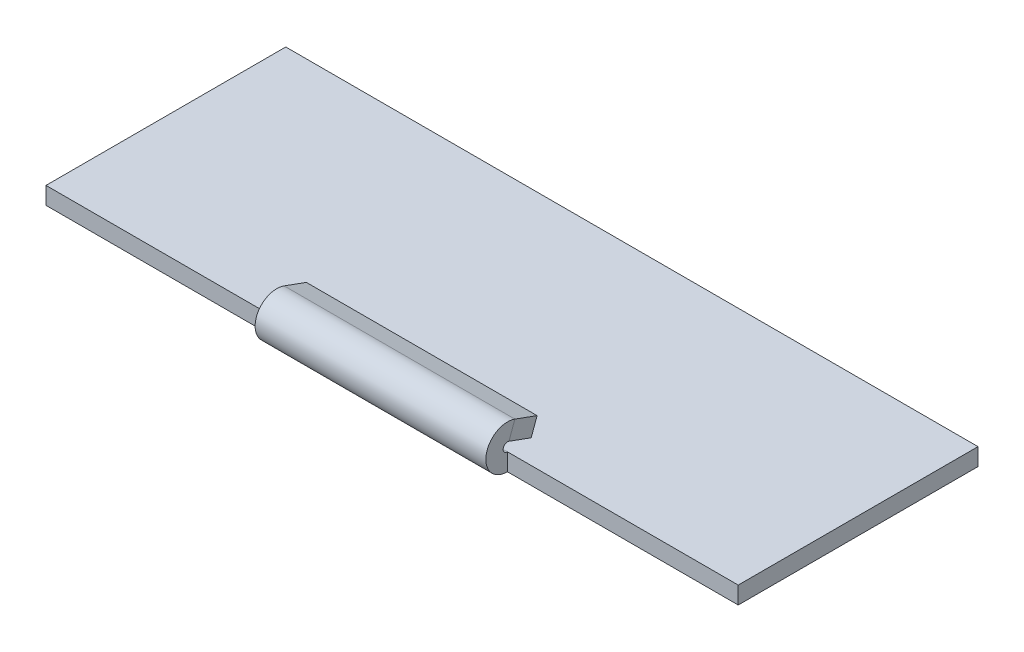
ISO-10303-21;
HEADER;
FILE_DESCRIPTION(('STEP AP214'),'2;1');
FILE_NAME('part.step','',(''),(''),'','','');
FILE_SCHEMA(('AUTOMOTIVE_DESIGN { 1 0 10303 214 1 1 1 1 }'));
ENDSEC;
DATA;
#1=APPLICATION_CONTEXT('core data for automotive mechanical design processes');
#2=APPLICATION_PROTOCOL_DEFINITION('international standard','automotive_design',2000,#1);
#3=PRODUCT_CONTEXT('',#1,'mechanical');
#4=PRODUCT('Part','Part','',(#3));
#5=PRODUCT_RELATED_PRODUCT_CATEGORY('part','',(#4));
#6=PRODUCT_DEFINITION_FORMATION('','',#4);
#7=PRODUCT_DEFINITION_CONTEXT('part definition',#1,'design');
#8=PRODUCT_DEFINITION('design','',#6,#7);
#9=PRODUCT_DEFINITION_SHAPE('','',#8);
#10=(LENGTH_UNIT() NAMED_UNIT(*) SI_UNIT(.MILLI.,.METRE.));
#11=(NAMED_UNIT(*) PLANE_ANGLE_UNIT() SI_UNIT($,.RADIAN.));
#12=(NAMED_UNIT(*) SI_UNIT($,.STERADIAN.) SOLID_ANGLE_UNIT());
#13=UNCERTAINTY_MEASURE_WITH_UNIT(LENGTH_MEASURE(1.E-05),#10,'distance_accuracy_value','');
#14=(GEOMETRIC_REPRESENTATION_CONTEXT(3) GLOBAL_UNCERTAINTY_ASSIGNED_CONTEXT((#13)) GLOBAL_UNIT_ASSIGNED_CONTEXT((#10,
#11,#12)) REPRESENTATION_CONTEXT('',''));
#15=CARTESIAN_POINT('',(0.,0.,0.));
#16=DIRECTION('',(0.,0.,1.));
#17=DIRECTION('',(1.,0.,0.));
#18=AXIS2_PLACEMENT_3D('',#15,#16,#17);
#19=CARTESIAN_POINT('',(0.,3.64863291385937,17.4952710197256));
#20=DIRECTION('',(0.,0.342020143325676,0.939692620785906));
#21=DIRECTION('',(1.,0.,0.));
#22=AXIS2_PLACEMENT_3D('',#19,#20,#21);
#23=PLANE('',#22);
#24=DIRECTION('',(1.,0.,0.));
#25=VECTOR('',#24,1.);
#26=CARTESIAN_POINT('',(0.,0.0684040286650639,18.7983677657964));
#27=LINE('',#26,#25);
#28=CARTESIAN_POINT('',(-25.4,0.0684040286650639,18.7983677657964));
#29=VERTEX_POINT('',#28);
#30=CARTESIAN_POINT('',(25.4,0.0684040286650639,18.7983677657964));
#31=VERTEX_POINT('',#30);
#32=EDGE_CURVE('E103',#29,#31,#27,.T.);
#33=ORIENTED_EDGE('',*,*,#32,.F.);
#34=DIRECTION('',(0.,0.939692620785906,-0.342020143325676));
#35=VECTOR('',#34,1.);
#36=CARTESIAN_POINT('',(-25.4,3.64863291385937,17.4952710197256));
#37=LINE('',#36,#35);
#38=CARTESIAN_POINT('',(-25.4,3.64863291385937,17.4952710197256));
#39=VERTEX_POINT('',#38);
#40=EDGE_CURVE('E159',#39,#29,#37,.F.);
#41=ORIENTED_EDGE('',*,*,#40,.F.);
#42=DIRECTION('',(1.,0.,0.));
#43=VECTOR('',#42,1.);
#44=CARTESIAN_POINT('',(0.,3.64863291385937,17.4952710197256));
#45=LINE('',#44,#43);
#46=CARTESIAN_POINT('',(25.4,3.64863291385937,17.4952710197256));
#47=VERTEX_POINT('',#46);
#48=EDGE_CURVE('E93',#39,#47,#45,.T.);
#49=ORIENTED_EDGE('',*,*,#48,.T.);
#50=DIRECTION('',(0.,0.939692620785906,-0.342020143325676));
#51=VECTOR('',#50,1.);
#52=CARTESIAN_POINT('',(25.4,3.64863291385937,17.4952710197256));
#53=LINE('',#52,#51);
#54=EDGE_CURVE('E120',#47,#31,#53,.F.);
#55=ORIENTED_EDGE('',*,*,#54,.T.);
#56=EDGE_LOOP('',(#33,#41,#49,#55));
#57=FACE_BOUND('',#56,.T.);
#58=ADVANCED_FACE('F37',(#57),#23,.F.);
#59=CARTESIAN_POINT('',(0.,4.53820951017612,19.9393626309811));
#60=DIRECTION('',(0.,0.939692620785906,-0.342020143325676));
#61=DIRECTION('',(0.,0.342020143325676,0.939692620785906));
#62=AXIS2_PLACEMENT_3D('',#59,#60,#61);
#63=PLANE('',#62);
#64=ORIENTED_EDGE('',*,*,#48,.F.);
#65=DIRECTION('',(0.,0.342020143325676,0.939692620785906));
#66=VECTOR('',#65,1.);
#67=CARTESIAN_POINT('',(-25.4,4.53820951017612,19.9393626309811));
#68=LINE('',#67,#66);
#69=CARTESIAN_POINT('',(-25.4,5.42778610649288,22.3834542422367));
#70=VERTEX_POINT('',#69);
#71=EDGE_CURVE('E160',#39,#70,#68,.T.);
#72=ORIENTED_EDGE('',*,*,#71,.T.);
#73=DIRECTION('',(-1.,0.,0.));
#74=VECTOR('',#73,1.);
#75=CARTESIAN_POINT('',(0.,5.42778610649288,22.3834542422367));
#76=LINE('',#75,#74);
#77=CARTESIAN_POINT('',(25.4,5.42778610649288,22.3834542422367));
#78=VERTEX_POINT('',#77);
#79=EDGE_CURVE('E106',#78,#70,#76,.T.);
#80=ORIENTED_EDGE('',*,*,#79,.F.);
#81=DIRECTION('',(0.,0.342020143325676,0.939692620785906));
#82=VECTOR('',#81,1.);
#83=CARTESIAN_POINT('',(25.4,4.53820951017612,19.9393626309811));
#84=LINE('',#83,#82);
#85=EDGE_CURVE('E127',#47,#78,#84,.T.);
#86=ORIENTED_EDGE('',*,*,#85,.F.);
#87=EDGE_LOOP('',(#64,#72,#80,#86));
#88=FACE_BOUND('',#87,.T.);
#89=ADVANCED_FACE('F198',(#88),#63,.T.);
#90=CARTESIAN_POINT('',(0.,0.95798062498182,21.2424593770519));
#91=DIRECTION('',(0.,0.939692620785906,-0.342020143325676));
#92=DIRECTION('',(0.,0.342020143325676,0.939692620785906));
#93=AXIS2_PLACEMENT_3D('',#90,#91,#92);
#94=PLANE('',#93);
#95=DIRECTION('',(0.,0.342020143325676,0.939692620785906));
#96=VECTOR('',#95,1.);
#97=CARTESIAN_POINT('',(-25.4,0.95798062498182,21.2424593770519));
#98=LINE('',#97,#96);
#99=CARTESIAN_POINT('',(-25.4,1.84755722129858,23.6865509883075));
#100=VERTEX_POINT('',#99);
#101=EDGE_CURVE('E156',#29,#100,#98,.T.);
#102=ORIENTED_EDGE('',*,*,#101,.F.);
#103=ORIENTED_EDGE('',*,*,#32,.T.);
#104=DIRECTION('',(0.,0.342020143325676,0.939692620785906));
#105=VECTOR('',#104,1.);
#106=CARTESIAN_POINT('',(25.4,0.95798062498182,21.2424593770519));
#107=LINE('',#106,#105);
#108=CARTESIAN_POINT('',(25.4,1.84755722129858,23.6865509883075));
#109=VERTEX_POINT('',#108);
#110=EDGE_CURVE('E124',#31,#109,#107,.T.);
#111=ORIENTED_EDGE('',*,*,#110,.T.);
#112=DIRECTION('',(1.,0.,0.));
#113=VECTOR('',#112,1.);
#114=CARTESIAN_POINT('',(0.,1.84755722129858,23.6865509883075));
#115=LINE('',#114,#113);
#116=EDGE_CURVE('E100',#109,#100,#115,.F.);
#117=ORIENTED_EDGE('',*,*,#116,.T.);
#118=EDGE_LOOP('',(#102,#103,#111,#117));
#119=FACE_BOUND('',#118,.T.);
#120=ADVANCED_FACE('F182',(#119),#94,.F.);
#121=CARTESIAN_POINT('',(76.2,0.952499999999991,24.0123251748252));
#122=DIRECTION('',(1.,0.,0.));
#123=DIRECTION('',(0.,0.939692620785906,-0.342020143325676));
#124=AXIS2_PLACEMENT_3D('',#121,#122,#123);
#125=CYLINDRICAL_SURFACE('',#124,4.7625);
#126=ORIENTED_EDGE('',*,*,#79,.T.);
#127=CARTESIAN_POINT('',(-25.4,0.952499999999997,24.0123251748252));
#128=DIRECTION('',(-1.,0.,0.));
#129=DIRECTION('',(0.,0.,1.));
#130=AXIS2_PLACEMENT_3D('',#127,#128,#129);
#131=CIRCLE('',#130,4.7625);
#132=CARTESIAN_POINT('',(-25.4,-3.81000000000001,24.0123251748252));
#133=VERTEX_POINT('',#132);
#134=EDGE_CURVE('E153',#70,#133,#131,.F.);
#135=ORIENTED_EDGE('',*,*,#134,.T.);
#136=DIRECTION('',(1.,0.,0.));
#137=VECTOR('',#136,1.);
#138=CARTESIAN_POINT('',(76.2,-3.81000000000001,24.0123251748252));
#139=LINE('',#138,#137);
#140=CARTESIAN_POINT('',(25.4,-3.81000000000001,24.0123251748252));
#141=VERTEX_POINT('',#140);
#142=EDGE_CURVE('E116',#141,#133,#139,.F.);
#143=ORIENTED_EDGE('',*,*,#142,.F.);
#144=CARTESIAN_POINT('',(25.4,0.952499999999994,24.0123251748252));
#145=DIRECTION('',(-1.,0.,0.));
#146=DIRECTION('',(0.,0.,1.));
#147=AXIS2_PLACEMENT_3D('',#144,#145,#146);
#148=CIRCLE('',#147,4.7625);
#149=EDGE_CURVE('E133',#78,#141,#148,.F.);
#150=ORIENTED_EDGE('',*,*,#149,.F.);
#151=EDGE_LOOP('',(#126,#135,#143,#150));
#152=FACE_BOUND('',#151,.T.);
#153=ADVANCED_FACE('F204',(#152),#125,.T.);
#154=CARTESIAN_POINT('',(76.2,0.952499999999991,24.0123251748252));
#155=DIRECTION('',(1.,0.,0.));
#156=DIRECTION('',(0.,0.939692620785906,-0.342020143325676));
#157=AXIS2_PLACEMENT_3D('',#154,#155,#156);
#158=CYLINDRICAL_SURFACE('',#157,0.952500000000003);
#159=CARTESIAN_POINT('',(-25.4,0.952499999999997,24.0123251748252));
#160=DIRECTION('',(1.,0.,0.));
#161=DIRECTION('',(0.,1.,0.));
#162=AXIS2_PLACEMENT_3D('',#159,#160,#161);
#163=CIRCLE('',#162,0.952500000000003);
#164=CARTESIAN_POINT('',(-25.4,0.,24.0123251748252));
#165=VERTEX_POINT('',#164);
#166=EDGE_CURVE('E148',#100,#165,#163,.T.);
#167=ORIENTED_EDGE('',*,*,#166,.F.);
#168=ORIENTED_EDGE('',*,*,#116,.F.);
#169=CARTESIAN_POINT('',(25.4,0.952499999999994,24.0123251748252));
#170=DIRECTION('',(1.,0.,0.));
#171=DIRECTION('',(0.,1.,0.));
#172=AXIS2_PLACEMENT_3D('',#169,#170,#171);
#173=CIRCLE('',#172,0.952500000000003);
#174=CARTESIAN_POINT('',(25.4,0.,24.0123251748252));
#175=VERTEX_POINT('',#174);
#176=EDGE_CURVE('E130',#109,#175,#173,.T.);
#177=ORIENTED_EDGE('',*,*,#176,.T.);
#178=DIRECTION('',(1.,0.,0.));
#179=VECTOR('',#178,1.);
#180=CARTESIAN_POINT('',(76.2,0.,24.0123251748252));
#181=LINE('',#180,#179);
#182=EDGE_CURVE('E117',#175,#165,#181,.F.);
#183=ORIENTED_EDGE('',*,*,#182,.T.);
#184=EDGE_LOOP('',(#167,#168,#177,#183));
#185=FACE_BOUND('',#184,.T.);
#186=ADVANCED_FACE('F232',(#185),#158,.F.);
#187=CARTESIAN_POINT('',(76.2,-3.81,-28.7748251748252));
#188=DIRECTION('',(1.,0.,0.));
#189=DIRECTION('',(0.,0.,-1.));
#190=AXIS2_PLACEMENT_3D('',#187,#188,#189);
#191=PLANE('',#190);
#192=DIRECTION('',(0.,0.,-1.));
#193=VECTOR('',#192,1.);
#194=CARTESIAN_POINT('',(76.2,0.,-28.7748251748252));
#195=LINE('',#194,#193);
#196=CARTESIAN_POINT('',(76.2,0.,24.0123251748252));
#197=VERTEX_POINT('',#196);
#198=CARTESIAN_POINT('',(76.2,0.,-28.7748251748252));
#199=VERTEX_POINT('',#198);
#200=EDGE_CURVE('E90',#197,#199,#195,.T.);
#201=ORIENTED_EDGE('',*,*,#200,.F.);
#202=DIRECTION('',(0.,-1.,0.));
#203=VECTOR('',#202,1.);
#204=CARTESIAN_POINT('',(76.2,0.,24.0123251748252));
#205=LINE('',#204,#203);
#206=CARTESIAN_POINT('',(76.2,-3.81000000000001,24.0123251748252));
#207=VERTEX_POINT('',#206);
#208=EDGE_CURVE('E52',#197,#207,#205,.T.);
#209=ORIENTED_EDGE('',*,*,#208,.T.);
#210=DIRECTION('',(0.,0.,-1.));
#211=VECTOR('',#210,1.);
#212=CARTESIAN_POINT('',(76.2,-3.81,-28.7748251748252));
#213=LINE('',#212,#211);
#214=CARTESIAN_POINT('',(76.2,-3.81,-28.7748251748252));
#215=VERTEX_POINT('',#214);
#216=EDGE_CURVE('E86',#207,#215,#213,.T.);
#217=ORIENTED_EDGE('',*,*,#216,.T.);
#218=DIRECTION('',(0.,1.,0.));
#219=VECTOR('',#218,1.);
#220=CARTESIAN_POINT('',(76.2,-3.81,-28.7748251748252));
#221=LINE('',#220,#219);
#222=EDGE_CURVE('E41',#215,#199,#221,.T.);
#223=ORIENTED_EDGE('',*,*,#222,.T.);
#224=EDGE_LOOP('',(#201,#209,#217,#223));
#225=FACE_BOUND('',#224,.T.);
#226=ADVANCED_FACE('F39',(#225),#191,.T.);
#227=CARTESIAN_POINT('',(-76.2,-3.81,-28.7748251748252));
#228=DIRECTION('',(-1.,0.,0.));
#229=DIRECTION('',(0.,0.,1.));
#230=AXIS2_PLACEMENT_3D('',#227,#228,#229);
#231=PLANE('',#230);
#232=DIRECTION('',(0.,-1.,0.));
#233=VECTOR('',#232,1.);
#234=CARTESIAN_POINT('',(-76.2,0.,24.0123251748252));
#235=LINE('',#234,#233);
#236=CARTESIAN_POINT('',(-76.2,0.,24.0123251748252));
#237=VERTEX_POINT('',#236);
#238=CARTESIAN_POINT('',(-76.2,-3.81000000000001,24.0123251748252));
#239=VERTEX_POINT('',#238);
#240=EDGE_CURVE('E83',#237,#239,#235,.T.);
#241=ORIENTED_EDGE('',*,*,#240,.F.);
#242=DIRECTION('',(0.,0.,1.));
#243=VECTOR('',#242,1.);
#244=CARTESIAN_POINT('',(-76.2,0.,-28.7748251748252));
#245=LINE('',#244,#243);
#246=CARTESIAN_POINT('',(-76.2,0.,-28.7748251748252));
#247=VERTEX_POINT('',#246);
#248=EDGE_CURVE('E80',#247,#237,#245,.T.);
#249=ORIENTED_EDGE('',*,*,#248,.F.);
#250=DIRECTION('',(0.,1.,0.));
#251=VECTOR('',#250,1.);
#252=CARTESIAN_POINT('',(-76.2,-3.81,-28.7748251748252));
#253=LINE('',#252,#251);
#254=CARTESIAN_POINT('',(-76.2,-3.81,-28.7748251748252));
#255=VERTEX_POINT('',#254);
#256=EDGE_CURVE('E11',#255,#247,#253,.T.);
#257=ORIENTED_EDGE('',*,*,#256,.F.);
#258=DIRECTION('',(0.,0.,1.));
#259=VECTOR('',#258,1.);
#260=CARTESIAN_POINT('',(-76.2,-3.81,-28.7748251748252));
#261=LINE('',#260,#259);
#262=EDGE_CURVE('E96',#255,#239,#261,.T.);
#263=ORIENTED_EDGE('',*,*,#262,.T.);
#264=EDGE_LOOP('',(#241,#249,#257,#263));
#265=FACE_BOUND('',#264,.T.);
#266=ADVANCED_FACE('F81',(#265),#231,.T.);
#267=CARTESIAN_POINT('',(-76.2,-3.81,-28.7748251748252));
#268=DIRECTION('',(0.,0.,-1.));
#269=DIRECTION('',(-1.,0.,0.));
#270=AXIS2_PLACEMENT_3D('',#267,#268,#269);
#271=PLANE('',#270);
#272=DIRECTION('',(-1.,0.,0.));
#273=VECTOR('',#272,1.);
#274=CARTESIAN_POINT('',(-76.2,0.,-28.7748251748252));
#275=LINE('',#274,#273);
#276=EDGE_CURVE('E75',#199,#247,#275,.T.);
#277=ORIENTED_EDGE('',*,*,#276,.F.);
#278=ORIENTED_EDGE('',*,*,#222,.F.);
#279=DIRECTION('',(-1.,0.,0.));
#280=VECTOR('',#279,1.);
#281=CARTESIAN_POINT('',(-76.2,-3.81,-28.7748251748252));
#282=LINE('',#281,#280);
#283=EDGE_CURVE('E77',#215,#255,#282,.T.);
#284=ORIENTED_EDGE('',*,*,#283,.T.);
#285=ORIENTED_EDGE('',*,*,#256,.T.);
#286=EDGE_LOOP('',(#277,#278,#284,#285));
#287=FACE_BOUND('',#286,.T.);
#288=ADVANCED_FACE('F72',(#287),#271,.T.);
#289=CARTESIAN_POINT('',(0.,-3.81,0.));
#290=DIRECTION('',(0.,1.,0.));
#291=DIRECTION('',(0.,0.,1.));
#292=AXIS2_PLACEMENT_3D('',#289,#290,#291);
#293=PLANE('',#292);
#294=ORIENTED_EDGE('',*,*,#216,.F.);
#295=EDGE_CURVE('E112',#207,#141,#139,.F.);
#296=ORIENTED_EDGE('',*,*,#295,.T.);
#297=ORIENTED_EDGE('',*,*,#142,.T.);
#298=DIRECTION('',(1.,0.,0.));
#299=VECTOR('',#298,1.);
#300=CARTESIAN_POINT('',(76.2,-3.81000000000001,24.0123251748252));
#301=LINE('',#300,#299);
#302=EDGE_CURVE('E141',#133,#239,#301,.F.);
#303=ORIENTED_EDGE('',*,*,#302,.T.);
#304=ORIENTED_EDGE('',*,*,#262,.F.);
#305=ORIENTED_EDGE('',*,*,#283,.F.);
#306=EDGE_LOOP('',(#294,#296,#297,#303,#304,#305));
#307=FACE_BOUND('',#306,.T.);
#308=ADVANCED_FACE('F239',(#307),#293,.F.);
#309=CARTESIAN_POINT('',(0.,0.,0.));
#310=DIRECTION('',(0.,1.,0.));
#311=DIRECTION('',(0.,0.,1.));
#312=AXIS2_PLACEMENT_3D('',#309,#310,#311);
#313=PLANE('',#312);
#314=EDGE_CURVE('E114',#197,#175,#181,.F.);
#315=ORIENTED_EDGE('',*,*,#314,.F.);
#316=ORIENTED_EDGE('',*,*,#200,.T.);
#317=ORIENTED_EDGE('',*,*,#276,.T.);
#318=ORIENTED_EDGE('',*,*,#248,.T.);
#319=DIRECTION('',(1.,0.,0.));
#320=VECTOR('',#319,1.);
#321=CARTESIAN_POINT('',(76.2,0.,24.0123251748252));
#322=LINE('',#321,#320);
#323=EDGE_CURVE('E145',#165,#237,#322,.F.);
#324=ORIENTED_EDGE('',*,*,#323,.F.);
#325=ORIENTED_EDGE('',*,*,#182,.F.);
#326=EDGE_LOOP('',(#315,#316,#317,#318,#324,#325));
#327=FACE_BOUND('',#326,.T.);
#328=ADVANCED_FACE('F88',(#327),#313,.T.);
#329=CARTESIAN_POINT('',(25.4,4.53820951017612,19.9393626309811));
#330=DIRECTION('',(-1.,0.,0.));
#331=DIRECTION('',(0.,0.342020143325676,0.939692620785906));
#332=AXIS2_PLACEMENT_3D('',#329,#330,#331);
#333=PLANE('',#332);
#334=ORIENTED_EDGE('',*,*,#85,.T.);
#335=DIRECTION('',(0.,0.939692620785906,-0.342020143325676));
#336=VECTOR('',#335,1.);
#337=CARTESIAN_POINT('',(25.4,5.42778610649288,22.3834542422367));
#338=LINE('',#337,#336);
#339=EDGE_CURVE('E123',#78,#109,#338,.F.);
#340=ORIENTED_EDGE('',*,*,#339,.T.);
#341=ORIENTED_EDGE('',*,*,#110,.F.);
#342=ORIENTED_EDGE('',*,*,#54,.F.);
#343=EDGE_LOOP('',(#334,#340,#341,#342));
#344=FACE_BOUND('',#343,.T.);
#345=ADVANCED_FACE('F192',(#344),#333,.F.);
#346=CARTESIAN_POINT('',(25.4,0.952499999999994,24.0123251748252));
#347=DIRECTION('',(1.,0.,0.));
#348=DIRECTION('',(0.,0.,-1.));
#349=AXIS2_PLACEMENT_3D('',#346,#347,#348);
#350=PLANE('',#349);
#351=ORIENTED_EDGE('',*,*,#339,.F.);
#352=ORIENTED_EDGE('',*,*,#149,.T.);
#353=DIRECTION('',(0.,1.,0.));
#354=VECTOR('',#353,1.);
#355=CARTESIAN_POINT('',(25.4,0.,24.0123251748252));
#356=LINE('',#355,#354);
#357=EDGE_CURVE('E136',#175,#141,#356,.F.);
#358=ORIENTED_EDGE('',*,*,#357,.F.);
#359=ORIENTED_EDGE('',*,*,#176,.F.);
#360=EDGE_LOOP('',(#351,#352,#358,#359));
#361=FACE_BOUND('',#360,.T.);
#362=ADVANCED_FACE('F235',(#361),#350,.T.);
#363=CARTESIAN_POINT('',(50.8,0.,24.0123251748252));
#364=DIRECTION('',(0.,0.,-1.));
#365=DIRECTION('',(1.,0.,0.));
#366=AXIS2_PLACEMENT_3D('',#363,#364,#365);
#367=PLANE('',#366);
#368=ORIENTED_EDGE('',*,*,#208,.F.);
#369=ORIENTED_EDGE('',*,*,#314,.T.);
#370=ORIENTED_EDGE('',*,*,#357,.T.);
#371=ORIENTED_EDGE('',*,*,#295,.F.);
#372=EDGE_LOOP('',(#368,#369,#370,#371));
#373=FACE_BOUND('',#372,.T.);
#374=ADVANCED_FACE('F236',(#373),#367,.F.);
#375=CARTESIAN_POINT('',(-25.4,4.53820951017612,19.9393626309811));
#376=DIRECTION('',(-1.,0.,0.));
#377=DIRECTION('',(0.,0.342020143325676,0.939692620785906));
#378=AXIS2_PLACEMENT_3D('',#375,#376,#377);
#379=PLANE('',#378);
#380=DIRECTION('',(0.,0.939692620785906,-0.342020143325676));
#381=VECTOR('',#380,1.);
#382=CARTESIAN_POINT('',(-25.4,5.42778610649288,22.3834542422367));
#383=LINE('',#382,#381);
#384=EDGE_CURVE('E163',#70,#100,#383,.F.);
#385=ORIENTED_EDGE('',*,*,#384,.F.);
#386=ORIENTED_EDGE('',*,*,#71,.F.);
#387=ORIENTED_EDGE('',*,*,#40,.T.);
#388=ORIENTED_EDGE('',*,*,#101,.T.);
#389=EDGE_LOOP('',(#385,#386,#387,#388));
#390=FACE_BOUND('',#389,.T.);
#391=ADVANCED_FACE('F173',(#390),#379,.T.);
#392=CARTESIAN_POINT('',(-25.4,0.952499999999997,24.0123251748252));
#393=DIRECTION('',(1.,0.,0.));
#394=DIRECTION('',(0.,0.,-1.));
#395=AXIS2_PLACEMENT_3D('',#392,#393,#394);
#396=PLANE('',#395);
#397=ORIENTED_EDGE('',*,*,#134,.F.);
#398=ORIENTED_EDGE('',*,*,#384,.T.);
#399=ORIENTED_EDGE('',*,*,#166,.T.);
#400=DIRECTION('',(0.,1.,0.));
#401=VECTOR('',#400,1.);
#402=CARTESIAN_POINT('',(-25.4,0.,24.0123251748252));
#403=LINE('',#402,#401);
#404=EDGE_CURVE('E144',#165,#133,#403,.F.);
#405=ORIENTED_EDGE('',*,*,#404,.T.);
#406=EDGE_LOOP('',(#397,#398,#399,#405));
#407=FACE_BOUND('',#406,.T.);
#408=ADVANCED_FACE('F296',(#407),#396,.F.);
#409=CARTESIAN_POINT('',(-50.8,0.,24.0123251748252));
#410=DIRECTION('',(0.,0.,-1.));
#411=DIRECTION('',(1.,0.,0.));
#412=AXIS2_PLACEMENT_3D('',#409,#410,#411);
#413=PLANE('',#412);
#414=ORIENTED_EDGE('',*,*,#404,.F.);
#415=ORIENTED_EDGE('',*,*,#323,.T.);
#416=ORIENTED_EDGE('',*,*,#240,.T.);
#417=ORIENTED_EDGE('',*,*,#302,.F.);
#418=EDGE_LOOP('',(#414,#415,#416,#417));
#419=FACE_BOUND('',#418,.T.);
#420=ADVANCED_FACE('F227',(#419),#413,.F.);
#421=CLOSED_SHELL('',(#58,#89,#120,#153,#186,#226,#266,#288,#308,#328,#345,#362,#374,#391,#408,#420));
#422=MANIFOLD_SOLID_BREP('B2',#421);
#423=ADVANCED_BREP_SHAPE_REPRESENTATION('',(#18,#422),#14);
#424=SHAPE_DEFINITION_REPRESENTATION(#9,#423);
ENDSEC;
END-ISO-10303-21;
